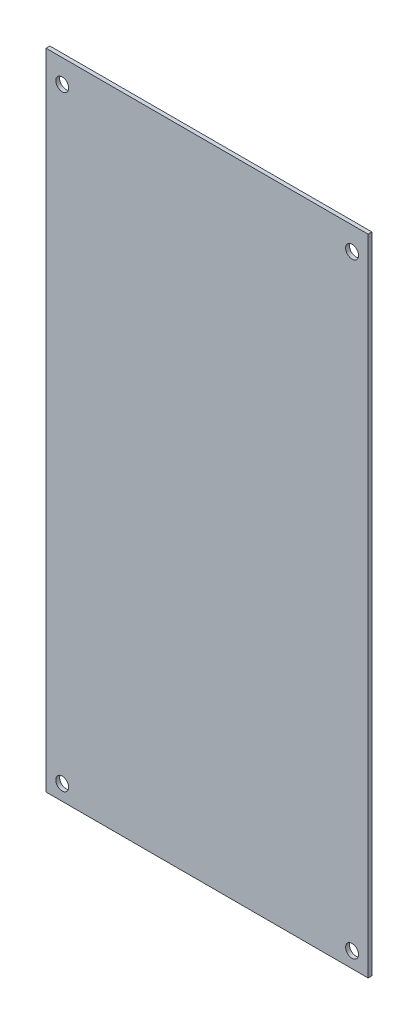
ISO-10303-21;
HEADER;
FILE_DESCRIPTION(('STEP AP214'),'2;1');
FILE_NAME('part.step','',(''),(''),'','','');
FILE_SCHEMA(('AUTOMOTIVE_DESIGN { 1 0 10303 214 1 1 1 1 }'));
ENDSEC;
DATA;
#1=APPLICATION_CONTEXT('core data for automotive mechanical design processes');
#2=APPLICATION_PROTOCOL_DEFINITION('international standard','automotive_design',2000,#1);
#3=PRODUCT_CONTEXT('',#1,'mechanical');
#4=PRODUCT('Part','Part','',(#3));
#5=PRODUCT_RELATED_PRODUCT_CATEGORY('part','',(#4));
#6=PRODUCT_DEFINITION_FORMATION('','',#4);
#7=PRODUCT_DEFINITION_CONTEXT('part definition',#1,'design');
#8=PRODUCT_DEFINITION('design','',#6,#7);
#9=PRODUCT_DEFINITION_SHAPE('','',#8);
#10=(LENGTH_UNIT() NAMED_UNIT(*) SI_UNIT(.MILLI.,.METRE.));
#11=(NAMED_UNIT(*) PLANE_ANGLE_UNIT() SI_UNIT($,.RADIAN.));
#12=(NAMED_UNIT(*) SI_UNIT($,.STERADIAN.) SOLID_ANGLE_UNIT());
#13=UNCERTAINTY_MEASURE_WITH_UNIT(LENGTH_MEASURE(1.E-05),#10,'distance_accuracy_value','');
#14=(GEOMETRIC_REPRESENTATION_CONTEXT(3) GLOBAL_UNCERTAINTY_ASSIGNED_CONTEXT((#13)) GLOBAL_UNIT_ASSIGNED_CONTEXT((#10,
#11,#12)) REPRESENTATION_CONTEXT('',''));
#15=CARTESIAN_POINT('',(0.,0.,0.));
#16=DIRECTION('',(0.,0.,1.));
#17=DIRECTION('',(1.,0.,0.));
#18=AXIS2_PLACEMENT_3D('',#15,#16,#17);
#19=CARTESIAN_POINT('',(0.,0.,3.));
#20=DIRECTION('',(1.,0.,0.));
#21=DIRECTION('',(0.,1.,0.));
#22=AXIS2_PLACEMENT_3D('',#19,#20,#21);
#23=PLANE('',#22);
#24=DIRECTION('',(0.,-1.,0.));
#25=VECTOR('',#24,1.);
#26=CARTESIAN_POINT('',(0.,0.,0.));
#27=LINE('',#26,#25);
#28=CARTESIAN_POINT('',(0.,500.,0.));
#29=VERTEX_POINT('',#28);
#30=CARTESIAN_POINT('',(0.,0.,0.));
#31=VERTEX_POINT('',#30);
#32=EDGE_CURVE('E96',#29,#31,#27,.T.);
#33=ORIENTED_EDGE('',*,*,#32,.T.);
#34=DIRECTION('',(0.,0.,-1.));
#35=VECTOR('',#34,1.);
#36=CARTESIAN_POINT('',(0.,0.,3.));
#37=LINE('',#36,#35);
#38=CARTESIAN_POINT('',(0.,0.,3.));
#39=VERTEX_POINT('',#38);
#40=EDGE_CURVE('E11',#39,#31,#37,.T.);
#41=ORIENTED_EDGE('',*,*,#40,.F.);
#42=DIRECTION('',(0.,-1.,0.));
#43=VECTOR('',#42,1.);
#44=CARTESIAN_POINT('',(0.,0.,3.));
#45=LINE('',#44,#43);
#46=CARTESIAN_POINT('',(0.,500.,3.));
#47=VERTEX_POINT('',#46);
#48=EDGE_CURVE('E84',#47,#39,#45,.T.);
#49=ORIENTED_EDGE('',*,*,#48,.F.);
#50=DIRECTION('',(0.,0.,-1.));
#51=VECTOR('',#50,1.);
#52=CARTESIAN_POINT('',(0.,500.,3.));
#53=LINE('',#52,#51);
#54=EDGE_CURVE('E92',#47,#29,#53,.T.);
#55=ORIENTED_EDGE('',*,*,#54,.T.);
#56=EDGE_LOOP('',(#33,#41,#49,#55));
#57=FACE_BOUND('',#56,.T.);
#58=ADVANCED_FACE('F33',(#57),#23,.F.);
#59=CARTESIAN_POINT('',(0.,0.,3.));
#60=DIRECTION('',(0.,1.,0.));
#61=DIRECTION('',(0.,0.,1.));
#62=AXIS2_PLACEMENT_3D('',#59,#60,#61);
#63=PLANE('',#62);
#64=DIRECTION('',(1.,0.,0.));
#65=VECTOR('',#64,1.);
#66=CARTESIAN_POINT('',(0.,0.,0.));
#67=LINE('',#66,#65);
#68=CARTESIAN_POINT('',(250.,0.,0.));
#69=VERTEX_POINT('',#68);
#70=EDGE_CURVE('E88',#31,#69,#67,.T.);
#71=ORIENTED_EDGE('',*,*,#70,.T.);
#72=DIRECTION('',(0.,0.,-1.));
#73=VECTOR('',#72,1.);
#74=CARTESIAN_POINT('',(250.,0.,3.));
#75=LINE('',#74,#73);
#76=CARTESIAN_POINT('',(250.,0.,3.));
#77=VERTEX_POINT('',#76);
#78=EDGE_CURVE('E41',#77,#69,#75,.T.);
#79=ORIENTED_EDGE('',*,*,#78,.F.);
#80=DIRECTION('',(1.,0.,0.));
#81=VECTOR('',#80,1.);
#82=CARTESIAN_POINT('',(0.,0.,3.));
#83=LINE('',#82,#81);
#84=EDGE_CURVE('E79',#39,#77,#83,.T.);
#85=ORIENTED_EDGE('',*,*,#84,.F.);
#86=ORIENTED_EDGE('',*,*,#40,.T.);
#87=EDGE_LOOP('',(#71,#79,#85,#86));
#88=FACE_BOUND('',#87,.T.);
#89=ADVANCED_FACE('F87',(#88),#63,.F.);
#90=CARTESIAN_POINT('',(250.,0.,3.));
#91=DIRECTION('',(-1.,0.,0.));
#92=DIRECTION('',(0.,-1.,0.));
#93=AXIS2_PLACEMENT_3D('',#90,#91,#92);
#94=PLANE('',#93);
#95=DIRECTION('',(0.,1.,0.));
#96=VECTOR('',#95,1.);
#97=CARTESIAN_POINT('',(250.,0.,0.));
#98=LINE('',#97,#96);
#99=CARTESIAN_POINT('',(250.,500.,0.));
#100=VERTEX_POINT('',#99);
#101=EDGE_CURVE('E66',#69,#100,#98,.T.);
#102=ORIENTED_EDGE('',*,*,#101,.T.);
#103=DIRECTION('',(0.,0.,-1.));
#104=VECTOR('',#103,1.);
#105=CARTESIAN_POINT('',(250.,500.,3.));
#106=LINE('',#105,#104);
#107=CARTESIAN_POINT('',(250.,500.,3.));
#108=VERTEX_POINT('',#107);
#109=EDGE_CURVE('E89',#108,#100,#106,.T.);
#110=ORIENTED_EDGE('',*,*,#109,.F.);
#111=DIRECTION('',(0.,1.,0.));
#112=VECTOR('',#111,1.);
#113=CARTESIAN_POINT('',(250.,0.,3.));
#114=LINE('',#113,#112);
#115=EDGE_CURVE('E82',#77,#108,#114,.T.);
#116=ORIENTED_EDGE('',*,*,#115,.F.);
#117=ORIENTED_EDGE('',*,*,#78,.T.);
#118=EDGE_LOOP('',(#102,#110,#116,#117));
#119=FACE_BOUND('',#118,.T.);
#120=ADVANCED_FACE('F90',(#119),#94,.F.);
#121=CARTESIAN_POINT('',(0.,500.,3.));
#122=DIRECTION('',(0.,-1.,0.));
#123=DIRECTION('',(0.,0.,-1.));
#124=AXIS2_PLACEMENT_3D('',#121,#122,#123);
#125=PLANE('',#124);
#126=DIRECTION('',(-1.,0.,0.));
#127=VECTOR('',#126,1.);
#128=CARTESIAN_POINT('',(0.,500.,0.));
#129=LINE('',#128,#127);
#130=EDGE_CURVE('E72',#100,#29,#129,.T.);
#131=ORIENTED_EDGE('',*,*,#130,.T.);
#132=ORIENTED_EDGE('',*,*,#54,.F.);
#133=DIRECTION('',(-1.,0.,0.));
#134=VECTOR('',#133,1.);
#135=CARTESIAN_POINT('',(0.,500.,3.));
#136=LINE('',#135,#134);
#137=EDGE_CURVE('E49',#108,#47,#136,.T.);
#138=ORIENTED_EDGE('',*,*,#137,.F.);
#139=ORIENTED_EDGE('',*,*,#109,.T.);
#140=EDGE_LOOP('',(#131,#132,#138,#139));
#141=FACE_BOUND('',#140,.T.);
#142=ADVANCED_FACE('F104',(#141),#125,.F.);
#143=CARTESIAN_POINT('',(0.,0.,3.));
#144=DIRECTION('',(0.,0.,-1.));
#145=DIRECTION('',(-1.,0.,0.));
#146=AXIS2_PLACEMENT_3D('',#143,#144,#145);
#147=PLANE('',#146);
#148=CARTESIAN_POINT('',(12.5618848715589,481.993805771851,3.));
#149=DIRECTION('',(0.,0.,1.));
#150=DIRECTION('',(1.,0.,0.));
#151=AXIS2_PLACEMENT_3D('',#148,#149,#150);
#152=CIRCLE('',#151,5.);
#153=CARTESIAN_POINT('',(17.5618848715589,481.993805771851,3.));
#154=VERTEX_POINT('',#153);
#155=EDGE_CURVE('E119',#154,#154,#152,.T.);
#156=ORIENTED_EDGE('',*,*,#155,.F.);
#157=EDGE_LOOP('',(#156));
#158=FACE_BOUND('',#157,.T.);
#159=CARTESIAN_POINT('',(237.561884871559,481.993805771851,3.));
#160=DIRECTION('',(0.,0.,1.));
#161=DIRECTION('',(1.,0.,0.));
#162=AXIS2_PLACEMENT_3D('',#159,#160,#161);
#163=CIRCLE('',#162,5.);
#164=CARTESIAN_POINT('',(242.561884871559,481.993805771851,3.));
#165=VERTEX_POINT('',#164);
#166=EDGE_CURVE('E125',#165,#165,#163,.T.);
#167=ORIENTED_EDGE('',*,*,#166,.F.);
#168=EDGE_LOOP('',(#167));
#169=FACE_BOUND('',#168,.T.);
#170=CARTESIAN_POINT('',(237.561884871559,11.9938057718514,3.));
#171=DIRECTION('',(0.,0.,1.));
#172=DIRECTION('',(1.,0.,0.));
#173=AXIS2_PLACEMENT_3D('',#170,#171,#172);
#174=CIRCLE('',#173,5.);
#175=CARTESIAN_POINT('',(242.561884871559,11.9938057718514,3.));
#176=VERTEX_POINT('',#175);
#177=EDGE_CURVE('E113',#176,#176,#174,.T.);
#178=ORIENTED_EDGE('',*,*,#177,.F.);
#179=EDGE_LOOP('',(#178));
#180=FACE_BOUND('',#179,.T.);
#181=CARTESIAN_POINT('',(12.561884871559,11.9938057718514,3.));
#182=DIRECTION('',(0.,0.,1.));
#183=DIRECTION('',(1.,0.,0.));
#184=AXIS2_PLACEMENT_3D('',#181,#182,#183);
#185=CIRCLE('',#184,5.);
#186=CARTESIAN_POINT('',(17.561884871559,11.9938057718514,3.));
#187=VERTEX_POINT('',#186);
#188=EDGE_CURVE('E99',#187,#187,#185,.T.);
#189=ORIENTED_EDGE('',*,*,#188,.F.);
#190=EDGE_LOOP('',(#189));
#191=FACE_BOUND('',#190,.T.);
#192=ORIENTED_EDGE('',*,*,#48,.T.);
#193=ORIENTED_EDGE('',*,*,#84,.T.);
#194=ORIENTED_EDGE('',*,*,#115,.T.);
#195=ORIENTED_EDGE('',*,*,#137,.T.);
#196=EDGE_LOOP('',(#192,#193,#194,#195));
#197=FACE_BOUND('',#196,.T.);
#198=ADVANCED_FACE('F80',(#158,#169,#180,#191,#197),#147,.F.);
#199=CARTESIAN_POINT('',(0.,0.,0.));
#200=DIRECTION('',(0.,0.,-1.));
#201=DIRECTION('',(-1.,0.,0.));
#202=AXIS2_PLACEMENT_3D('',#199,#200,#201);
#203=PLANE('',#202);
#204=CARTESIAN_POINT('',(12.5618848715589,481.993805771851,0.));
#205=DIRECTION('',(0.,0.,-1.));
#206=DIRECTION('',(-1.,0.,0.));
#207=AXIS2_PLACEMENT_3D('',#204,#205,#206);
#208=CIRCLE('',#207,5.);
#209=CARTESIAN_POINT('',(17.5618848715589,481.993805771851,0.));
#210=VERTEX_POINT('',#209);
#211=EDGE_CURVE('E128',#210,#210,#208,.F.);
#212=ORIENTED_EDGE('',*,*,#211,.T.);
#213=EDGE_LOOP('',(#212));
#214=FACE_BOUND('',#213,.T.);
#215=CARTESIAN_POINT('',(237.561884871559,481.993805771851,0.));
#216=DIRECTION('',(0.,0.,-1.));
#217=DIRECTION('',(-1.,0.,0.));
#218=AXIS2_PLACEMENT_3D('',#215,#216,#217);
#219=CIRCLE('',#218,5.);
#220=CARTESIAN_POINT('',(242.561884871559,481.993805771851,0.));
#221=VERTEX_POINT('',#220);
#222=EDGE_CURVE('E122',#221,#221,#219,.F.);
#223=ORIENTED_EDGE('',*,*,#222,.T.);
#224=EDGE_LOOP('',(#223));
#225=FACE_BOUND('',#224,.T.);
#226=CARTESIAN_POINT('',(237.561884871559,11.9938057718514,0.));
#227=DIRECTION('',(0.,0.,-1.));
#228=DIRECTION('',(-1.,0.,0.));
#229=AXIS2_PLACEMENT_3D('',#226,#227,#228);
#230=CIRCLE('',#229,5.);
#231=CARTESIAN_POINT('',(242.561884871559,11.9938057718514,0.));
#232=VERTEX_POINT('',#231);
#233=EDGE_CURVE('E116',#232,#232,#230,.F.);
#234=ORIENTED_EDGE('',*,*,#233,.T.);
#235=EDGE_LOOP('',(#234));
#236=FACE_BOUND('',#235,.T.);
#237=CARTESIAN_POINT('',(12.561884871559,11.9938057718514,0.));
#238=DIRECTION('',(0.,0.,-1.));
#239=DIRECTION('',(-1.,0.,0.));
#240=AXIS2_PLACEMENT_3D('',#237,#238,#239);
#241=CIRCLE('',#240,5.);
#242=CARTESIAN_POINT('',(17.561884871559,11.9938057718514,0.));
#243=VERTEX_POINT('',#242);
#244=EDGE_CURVE('E110',#243,#243,#241,.F.);
#245=ORIENTED_EDGE('',*,*,#244,.T.);
#246=EDGE_LOOP('',(#245));
#247=FACE_BOUND('',#246,.T.);
#248=ORIENTED_EDGE('',*,*,#32,.F.);
#249=ORIENTED_EDGE('',*,*,#130,.F.);
#250=ORIENTED_EDGE('',*,*,#101,.F.);
#251=ORIENTED_EDGE('',*,*,#70,.F.);
#252=EDGE_LOOP('',(#248,#249,#250,#251));
#253=FACE_BOUND('',#252,.T.);
#254=ADVANCED_FACE('F107',(#214,#225,#236,#247,#253),#203,.T.);
#255=CARTESIAN_POINT('',(12.561884871559,11.9938057718514,-0.00100000000000013));
#256=DIRECTION('',(0.,0.,1.));
#257=DIRECTION('',(1.,0.,0.));
#258=AXIS2_PLACEMENT_3D('',#255,#256,#257);
#259=CYLINDRICAL_SURFACE('',#258,5.);
#260=CARTESIAN_POINT('',(17.561884871559,11.9938057718514,0.));
#261=CARTESIAN_POINT('',(17.561884871559,11.9938057718514,0.03125));
#262=CARTESIAN_POINT('',(17.561884871559,11.9938057718514,0.0625));
#263=CARTESIAN_POINT('',(17.561884871559,11.9938057718514,0.125));
#264=CARTESIAN_POINT('',(17.561884871559,11.9938057718514,0.15625));
#265=CARTESIAN_POINT('',(17.561884871559,11.9938057718514,0.21875));
#266=CARTESIAN_POINT('',(17.561884871559,11.9938057718514,0.25));
#267=CARTESIAN_POINT('',(17.561884871559,11.9938057718514,0.3125));
#268=CARTESIAN_POINT('',(17.561884871559,11.9938057718514,0.34375));
#269=CARTESIAN_POINT('',(17.561884871559,11.9938057718514,0.40625));
#270=CARTESIAN_POINT('',(17.561884871559,11.9938057718514,0.4375));
#271=CARTESIAN_POINT('',(17.561884871559,11.9938057718514,0.5));
#272=CARTESIAN_POINT('',(17.561884871559,11.9938057718514,0.53125));
#273=CARTESIAN_POINT('',(17.561884871559,11.9938057718514,0.59375));
#274=CARTESIAN_POINT('',(17.561884871559,11.9938057718514,0.625));
#275=CARTESIAN_POINT('',(17.561884871559,11.9938057718514,0.6875));
#276=CARTESIAN_POINT('',(17.561884871559,11.9938057718514,0.71875));
#277=CARTESIAN_POINT('',(17.561884871559,11.9938057718514,0.78125));
#278=CARTESIAN_POINT('',(17.561884871559,11.9938057718514,0.8125));
#279=CARTESIAN_POINT('',(17.561884871559,11.9938057718514,0.875));
#280=CARTESIAN_POINT('',(17.561884871559,11.9938057718514,0.90625));
#281=CARTESIAN_POINT('',(17.561884871559,11.9938057718514,0.96875));
#282=CARTESIAN_POINT('',(17.561884871559,11.9938057718514,1.));
#283=CARTESIAN_POINT('',(17.561884871559,11.9938057718514,1.0625));
#284=CARTESIAN_POINT('',(17.561884871559,11.9938057718514,1.09375));
#285=CARTESIAN_POINT('',(17.561884871559,11.9938057718514,1.15625));
#286=CARTESIAN_POINT('',(17.561884871559,11.9938057718514,1.1875));
#287=CARTESIAN_POINT('',(17.561884871559,11.9938057718514,1.25));
#288=CARTESIAN_POINT('',(17.561884871559,11.9938057718514,1.28125));
#289=CARTESIAN_POINT('',(17.561884871559,11.9938057718514,1.34375));
#290=CARTESIAN_POINT('',(17.561884871559,11.9938057718514,1.375));
#291=CARTESIAN_POINT('',(17.561884871559,11.9938057718514,1.4375));
#292=CARTESIAN_POINT('',(17.561884871559,11.9938057718514,1.46875));
#293=CARTESIAN_POINT('',(17.561884871559,11.9938057718514,1.53125));
#294=CARTESIAN_POINT('',(17.561884871559,11.9938057718514,1.5625));
#295=CARTESIAN_POINT('',(17.561884871559,11.9938057718514,1.625));
#296=CARTESIAN_POINT('',(17.561884871559,11.9938057718514,1.65625));
#297=CARTESIAN_POINT('',(17.561884871559,11.9938057718514,1.71875));
#298=CARTESIAN_POINT('',(17.561884871559,11.9938057718514,1.75));
#299=CARTESIAN_POINT('',(17.561884871559,11.9938057718514,1.8125));
#300=CARTESIAN_POINT('',(17.561884871559,11.9938057718514,1.84375));
#301=CARTESIAN_POINT('',(17.561884871559,11.9938057718514,1.90625));
#302=CARTESIAN_POINT('',(17.561884871559,11.9938057718514,1.9375));
#303=CARTESIAN_POINT('',(17.561884871559,11.9938057718514,2.));
#304=CARTESIAN_POINT('',(17.561884871559,11.9938057718514,2.03125));
#305=CARTESIAN_POINT('',(17.561884871559,11.9938057718514,2.09375));
#306=CARTESIAN_POINT('',(17.561884871559,11.9938057718514,2.125));
#307=CARTESIAN_POINT('',(17.561884871559,11.9938057718514,2.1875));
#308=CARTESIAN_POINT('',(17.561884871559,11.9938057718514,2.21875));
#309=CARTESIAN_POINT('',(17.561884871559,11.9938057718514,2.28125));
#310=CARTESIAN_POINT('',(17.561884871559,11.9938057718514,2.3125));
#311=CARTESIAN_POINT('',(17.561884871559,11.9938057718514,2.375));
#312=CARTESIAN_POINT('',(17.561884871559,11.9938057718514,2.40625));
#313=CARTESIAN_POINT('',(17.561884871559,11.9938057718514,2.46875));
#314=CARTESIAN_POINT('',(17.561884871559,11.9938057718514,2.5));
#315=CARTESIAN_POINT('',(17.561884871559,11.9938057718514,2.5625));
#316=CARTESIAN_POINT('',(17.561884871559,11.9938057718514,2.59375));
#317=CARTESIAN_POINT('',(17.561884871559,11.9938057718514,2.65625));
#318=CARTESIAN_POINT('',(17.561884871559,11.9938057718514,2.6875));
#319=CARTESIAN_POINT('',(17.561884871559,11.9938057718514,2.75));
#320=CARTESIAN_POINT('',(17.561884871559,11.9938057718514,2.78125));
#321=CARTESIAN_POINT('',(17.561884871559,11.9938057718514,2.84375));
#322=CARTESIAN_POINT('',(17.561884871559,11.9938057718514,2.875));
#323=CARTESIAN_POINT('',(17.561884871559,11.9938057718514,2.9375));
#324=CARTESIAN_POINT('',(17.561884871559,11.9938057718514,2.96875));
#325=CARTESIAN_POINT('',(17.561884871559,11.9938057718514,3.));
#326=B_SPLINE_CURVE_WITH_KNOTS('',3,(#260,#261,#262,#263,#264,#265,#266,#267,#268,#269,#270,
#271,#272,#273,#274,#275,#276,#277,#278,#279,#280,#281,#282,#283,#284,#285,#286,#287,#288,#289,
#290,#291,#292,#293,#294,#295,#296,#297,#298,#299,#300,#301,#302,#303,#304,#305,#306,#307,#308,
#309,#310,#311,#312,#313,#314,#315,#316,#317,#318,#319,#320,#321,#322,#323,#324,#325),
.UNSPECIFIED.,.F.,.F.,(4,2,2,2,2,2,2,2,2,2,2,2,2,2,2,2,2,2,2,2,2,2,2,2,2,2,2,2,2,2,2,2,4),(0.,
0.09375,0.1875,0.28125,0.375,0.46875,0.5625,0.65625,0.75,0.84375,0.9375,1.03125,1.125,1.21875,
1.3125,1.40625,1.5,1.59375,1.6875,1.78125,1.875,1.96875,2.0625,2.15625,2.25,2.34375,2.4375,
2.53125,2.625,2.71875,2.8125,2.90625,3.),.UNSPECIFIED.);
#327=EDGE_CURVE('BSEAM145',#243,#187,#326,.T.);
#328=ORIENTED_EDGE('',*,*,#244,.F.);
#329=ORIENTED_EDGE('',*,*,#188,.T.);
#330=ORIENTED_EDGE('',*,*,#327,.T.);
#331=ORIENTED_EDGE('',*,*,#327,.F.);
#332=EDGE_LOOP('',(#328,#330,#329,#331));
#333=FACE_BOUND('',#332,.T.);
#334=ADVANCED_FACE('F145',(#333),#259,.F.);
#335=CARTESIAN_POINT('',(237.561884871559,11.9938057718514,-0.00100000000000013));
#336=DIRECTION('',(0.,0.,1.));
#337=DIRECTION('',(1.,0.,0.));
#338=AXIS2_PLACEMENT_3D('',#335,#336,#337);
#339=CYLINDRICAL_SURFACE('',#338,5.);
#340=CARTESIAN_POINT('',(242.561884871559,11.9938057718514,0.));
#341=CARTESIAN_POINT('',(242.561884871559,11.9938057718514,0.03125));
#342=CARTESIAN_POINT('',(242.561884871559,11.9938057718514,0.0625));
#343=CARTESIAN_POINT('',(242.561884871559,11.9938057718514,0.125));
#344=CARTESIAN_POINT('',(242.561884871559,11.9938057718514,0.15625));
#345=CARTESIAN_POINT('',(242.561884871559,11.9938057718514,0.21875));
#346=CARTESIAN_POINT('',(242.561884871559,11.9938057718514,0.25));
#347=CARTESIAN_POINT('',(242.561884871559,11.9938057718514,0.3125));
#348=CARTESIAN_POINT('',(242.561884871559,11.9938057718514,0.34375));
#349=CARTESIAN_POINT('',(242.561884871559,11.9938057718514,0.40625));
#350=CARTESIAN_POINT('',(242.561884871559,11.9938057718514,0.4375));
#351=CARTESIAN_POINT('',(242.561884871559,11.9938057718514,0.5));
#352=CARTESIAN_POINT('',(242.561884871559,11.9938057718514,0.53125));
#353=CARTESIAN_POINT('',(242.561884871559,11.9938057718514,0.59375));
#354=CARTESIAN_POINT('',(242.561884871559,11.9938057718514,0.625));
#355=CARTESIAN_POINT('',(242.561884871559,11.9938057718514,0.6875));
#356=CARTESIAN_POINT('',(242.561884871559,11.9938057718514,0.71875));
#357=CARTESIAN_POINT('',(242.561884871559,11.9938057718514,0.78125));
#358=CARTESIAN_POINT('',(242.561884871559,11.9938057718514,0.8125));
#359=CARTESIAN_POINT('',(242.561884871559,11.9938057718514,0.875));
#360=CARTESIAN_POINT('',(242.561884871559,11.9938057718514,0.90625));
#361=CARTESIAN_POINT('',(242.561884871559,11.9938057718514,0.96875));
#362=CARTESIAN_POINT('',(242.561884871559,11.9938057718514,1.));
#363=CARTESIAN_POINT('',(242.561884871559,11.9938057718514,1.0625));
#364=CARTESIAN_POINT('',(242.561884871559,11.9938057718514,1.09375));
#365=CARTESIAN_POINT('',(242.561884871559,11.9938057718514,1.15625));
#366=CARTESIAN_POINT('',(242.561884871559,11.9938057718514,1.1875));
#367=CARTESIAN_POINT('',(242.561884871559,11.9938057718514,1.25));
#368=CARTESIAN_POINT('',(242.561884871559,11.9938057718514,1.28125));
#369=CARTESIAN_POINT('',(242.561884871559,11.9938057718514,1.34375));
#370=CARTESIAN_POINT('',(242.561884871559,11.9938057718514,1.375));
#371=CARTESIAN_POINT('',(242.561884871559,11.9938057718514,1.4375));
#372=CARTESIAN_POINT('',(242.561884871559,11.9938057718514,1.46875));
#373=CARTESIAN_POINT('',(242.561884871559,11.9938057718514,1.53125));
#374=CARTESIAN_POINT('',(242.561884871559,11.9938057718514,1.5625));
#375=CARTESIAN_POINT('',(242.561884871559,11.9938057718514,1.625));
#376=CARTESIAN_POINT('',(242.561884871559,11.9938057718514,1.65625));
#377=CARTESIAN_POINT('',(242.561884871559,11.9938057718514,1.71875));
#378=CARTESIAN_POINT('',(242.561884871559,11.9938057718514,1.75));
#379=CARTESIAN_POINT('',(242.561884871559,11.9938057718514,1.8125));
#380=CARTESIAN_POINT('',(242.561884871559,11.9938057718514,1.84375));
#381=CARTESIAN_POINT('',(242.561884871559,11.9938057718514,1.90625));
#382=CARTESIAN_POINT('',(242.561884871559,11.9938057718514,1.9375));
#383=CARTESIAN_POINT('',(242.561884871559,11.9938057718514,2.));
#384=CARTESIAN_POINT('',(242.561884871559,11.9938057718514,2.03125));
#385=CARTESIAN_POINT('',(242.561884871559,11.9938057718514,2.09375));
#386=CARTESIAN_POINT('',(242.561884871559,11.9938057718514,2.125));
#387=CARTESIAN_POINT('',(242.561884871559,11.9938057718514,2.1875));
#388=CARTESIAN_POINT('',(242.561884871559,11.9938057718514,2.21875));
#389=CARTESIAN_POINT('',(242.561884871559,11.9938057718514,2.28125));
#390=CARTESIAN_POINT('',(242.561884871559,11.9938057718514,2.3125));
#391=CARTESIAN_POINT('',(242.561884871559,11.9938057718514,2.375));
#392=CARTESIAN_POINT('',(242.561884871559,11.9938057718514,2.40625));
#393=CARTESIAN_POINT('',(242.561884871559,11.9938057718514,2.46875));
#394=CARTESIAN_POINT('',(242.561884871559,11.9938057718514,2.5));
#395=CARTESIAN_POINT('',(242.561884871559,11.9938057718514,2.5625));
#396=CARTESIAN_POINT('',(242.561884871559,11.9938057718514,2.59375));
#397=CARTESIAN_POINT('',(242.561884871559,11.9938057718514,2.65625));
#398=CARTESIAN_POINT('',(242.561884871559,11.9938057718514,2.6875));
#399=CARTESIAN_POINT('',(242.561884871559,11.9938057718514,2.75));
#400=CARTESIAN_POINT('',(242.561884871559,11.9938057718514,2.78125));
#401=CARTESIAN_POINT('',(242.561884871559,11.9938057718514,2.84375));
#402=CARTESIAN_POINT('',(242.561884871559,11.9938057718514,2.875));
#403=CARTESIAN_POINT('',(242.561884871559,11.9938057718514,2.9375));
#404=CARTESIAN_POINT('',(242.561884871559,11.9938057718514,2.96875));
#405=CARTESIAN_POINT('',(242.561884871559,11.9938057718514,3.));
#406=B_SPLINE_CURVE_WITH_KNOTS('',3,(#340,#341,#342,#343,#344,#345,#346,#347,#348,#349,#350,
#351,#352,#353,#354,#355,#356,#357,#358,#359,#360,#361,#362,#363,#364,#365,#366,#367,#368,#369,
#370,#371,#372,#373,#374,#375,#376,#377,#378,#379,#380,#381,#382,#383,#384,#385,#386,#387,#388,
#389,#390,#391,#392,#393,#394,#395,#396,#397,#398,#399,#400,#401,#402,#403,#404,#405),
.UNSPECIFIED.,.F.,.F.,(4,2,2,2,2,2,2,2,2,2,2,2,2,2,2,2,2,2,2,2,2,2,2,2,2,2,2,2,2,2,2,2,4),(0.,
0.09375,0.1875,0.28125,0.375,0.46875,0.5625,0.65625,0.75,0.84375,0.9375,1.03125,1.125,1.21875,
1.3125,1.40625,1.5,1.59375,1.6875,1.78125,1.875,1.96875,2.0625,2.15625,2.25,2.34375,2.4375,
2.53125,2.625,2.71875,2.8125,2.90625,3.),.UNSPECIFIED.);
#407=EDGE_CURVE('BSEAM147',#232,#176,#406,.T.);
#408=ORIENTED_EDGE('',*,*,#233,.F.);
#409=ORIENTED_EDGE('',*,*,#177,.T.);
#410=ORIENTED_EDGE('',*,*,#407,.T.);
#411=ORIENTED_EDGE('',*,*,#407,.F.);
#412=EDGE_LOOP('',(#408,#410,#409,#411));
#413=FACE_BOUND('',#412,.T.);
#414=ADVANCED_FACE('F147',(#413),#339,.F.);
#415=CARTESIAN_POINT('',(237.561884871559,481.993805771851,-0.00100000000000013));
#416=DIRECTION('',(0.,0.,1.));
#417=DIRECTION('',(1.,0.,0.));
#418=AXIS2_PLACEMENT_3D('',#415,#416,#417);
#419=CYLINDRICAL_SURFACE('',#418,5.);
#420=CARTESIAN_POINT('',(242.561884871559,481.993805771851,0.));
#421=CARTESIAN_POINT('',(242.561884871559,481.993805771851,0.03125));
#422=CARTESIAN_POINT('',(242.561884871559,481.993805771851,0.0625));
#423=CARTESIAN_POINT('',(242.561884871559,481.993805771851,0.125));
#424=CARTESIAN_POINT('',(242.561884871559,481.993805771851,0.15625));
#425=CARTESIAN_POINT('',(242.561884871559,481.993805771851,0.21875));
#426=CARTESIAN_POINT('',(242.561884871559,481.993805771851,0.25));
#427=CARTESIAN_POINT('',(242.561884871559,481.993805771851,0.3125));
#428=CARTESIAN_POINT('',(242.561884871559,481.993805771851,0.34375));
#429=CARTESIAN_POINT('',(242.561884871559,481.993805771851,0.40625));
#430=CARTESIAN_POINT('',(242.561884871559,481.993805771851,0.4375));
#431=CARTESIAN_POINT('',(242.561884871559,481.993805771851,0.5));
#432=CARTESIAN_POINT('',(242.561884871559,481.993805771851,0.53125));
#433=CARTESIAN_POINT('',(242.561884871559,481.993805771851,0.59375));
#434=CARTESIAN_POINT('',(242.561884871559,481.993805771851,0.625));
#435=CARTESIAN_POINT('',(242.561884871559,481.993805771851,0.6875));
#436=CARTESIAN_POINT('',(242.561884871559,481.993805771851,0.71875));
#437=CARTESIAN_POINT('',(242.561884871559,481.993805771851,0.78125));
#438=CARTESIAN_POINT('',(242.561884871559,481.993805771851,0.8125));
#439=CARTESIAN_POINT('',(242.561884871559,481.993805771851,0.875));
#440=CARTESIAN_POINT('',(242.561884871559,481.993805771851,0.90625));
#441=CARTESIAN_POINT('',(242.561884871559,481.993805771851,0.96875));
#442=CARTESIAN_POINT('',(242.561884871559,481.993805771851,1.));
#443=CARTESIAN_POINT('',(242.561884871559,481.993805771851,1.0625));
#444=CARTESIAN_POINT('',(242.561884871559,481.993805771851,1.09375));
#445=CARTESIAN_POINT('',(242.561884871559,481.993805771851,1.15625));
#446=CARTESIAN_POINT('',(242.561884871559,481.993805771851,1.1875));
#447=CARTESIAN_POINT('',(242.561884871559,481.993805771851,1.25));
#448=CARTESIAN_POINT('',(242.561884871559,481.993805771851,1.28125));
#449=CARTESIAN_POINT('',(242.561884871559,481.993805771851,1.34375));
#450=CARTESIAN_POINT('',(242.561884871559,481.993805771851,1.375));
#451=CARTESIAN_POINT('',(242.561884871559,481.993805771851,1.4375));
#452=CARTESIAN_POINT('',(242.561884871559,481.993805771851,1.46875));
#453=CARTESIAN_POINT('',(242.561884871559,481.993805771851,1.53125));
#454=CARTESIAN_POINT('',(242.561884871559,481.993805771851,1.5625));
#455=CARTESIAN_POINT('',(242.561884871559,481.993805771851,1.625));
#456=CARTESIAN_POINT('',(242.561884871559,481.993805771851,1.65625));
#457=CARTESIAN_POINT('',(242.561884871559,481.993805771851,1.71875));
#458=CARTESIAN_POINT('',(242.561884871559,481.993805771851,1.75));
#459=CARTESIAN_POINT('',(242.561884871559,481.993805771851,1.8125));
#460=CARTESIAN_POINT('',(242.561884871559,481.993805771851,1.84375));
#461=CARTESIAN_POINT('',(242.561884871559,481.993805771851,1.90625));
#462=CARTESIAN_POINT('',(242.561884871559,481.993805771851,1.9375));
#463=CARTESIAN_POINT('',(242.561884871559,481.993805771851,2.));
#464=CARTESIAN_POINT('',(242.561884871559,481.993805771851,2.03125));
#465=CARTESIAN_POINT('',(242.561884871559,481.993805771851,2.09375));
#466=CARTESIAN_POINT('',(242.561884871559,481.993805771851,2.125));
#467=CARTESIAN_POINT('',(242.561884871559,481.993805771851,2.1875));
#468=CARTESIAN_POINT('',(242.561884871559,481.993805771851,2.21875));
#469=CARTESIAN_POINT('',(242.561884871559,481.993805771851,2.28125));
#470=CARTESIAN_POINT('',(242.561884871559,481.993805771851,2.3125));
#471=CARTESIAN_POINT('',(242.561884871559,481.993805771851,2.375));
#472=CARTESIAN_POINT('',(242.561884871559,481.993805771851,2.40625));
#473=CARTESIAN_POINT('',(242.561884871559,481.993805771851,2.46875));
#474=CARTESIAN_POINT('',(242.561884871559,481.993805771851,2.5));
#475=CARTESIAN_POINT('',(242.561884871559,481.993805771851,2.5625));
#476=CARTESIAN_POINT('',(242.561884871559,481.993805771851,2.59375));
#477=CARTESIAN_POINT('',(242.561884871559,481.993805771851,2.65625));
#478=CARTESIAN_POINT('',(242.561884871559,481.993805771851,2.6875));
#479=CARTESIAN_POINT('',(242.561884871559,481.993805771851,2.75));
#480=CARTESIAN_POINT('',(242.561884871559,481.993805771851,2.78125));
#481=CARTESIAN_POINT('',(242.561884871559,481.993805771851,2.84375));
#482=CARTESIAN_POINT('',(242.561884871559,481.993805771851,2.875));
#483=CARTESIAN_POINT('',(242.561884871559,481.993805771851,2.9375));
#484=CARTESIAN_POINT('',(242.561884871559,481.993805771851,2.96875));
#485=CARTESIAN_POINT('',(242.561884871559,481.993805771851,3.));
#486=B_SPLINE_CURVE_WITH_KNOTS('',3,(#420,#421,#422,#423,#424,#425,#426,#427,#428,#429,#430,
#431,#432,#433,#434,#435,#436,#437,#438,#439,#440,#441,#442,#443,#444,#445,#446,#447,#448,#449,
#450,#451,#452,#453,#454,#455,#456,#457,#458,#459,#460,#461,#462,#463,#464,#465,#466,#467,#468,
#469,#470,#471,#472,#473,#474,#475,#476,#477,#478,#479,#480,#481,#482,#483,#484,#485),
.UNSPECIFIED.,.F.,.F.,(4,2,2,2,2,2,2,2,2,2,2,2,2,2,2,2,2,2,2,2,2,2,2,2,2,2,2,2,2,2,2,2,4),(0.,
0.09375,0.1875,0.28125,0.375,0.46875,0.5625,0.65625,0.75,0.84375,0.9375,1.03125,1.125,1.21875,
1.3125,1.40625,1.5,1.59375,1.6875,1.78125,1.875,1.96875,2.0625,2.15625,2.25,2.34375,2.4375,
2.53125,2.625,2.71875,2.8125,2.90625,3.),.UNSPECIFIED.);
#487=EDGE_CURVE('BSEAM154',#221,#165,#486,.T.);
#488=ORIENTED_EDGE('',*,*,#222,.F.);
#489=ORIENTED_EDGE('',*,*,#166,.T.);
#490=ORIENTED_EDGE('',*,*,#487,.T.);
#491=ORIENTED_EDGE('',*,*,#487,.F.);
#492=EDGE_LOOP('',(#488,#490,#489,#491));
#493=FACE_BOUND('',#492,.T.);
#494=ADVANCED_FACE('F154',(#493),#419,.F.);
#495=CARTESIAN_POINT('',(12.5618848715589,481.993805771851,-0.00100000000000013));
#496=DIRECTION('',(0.,0.,1.));
#497=DIRECTION('',(1.,0.,0.));
#498=AXIS2_PLACEMENT_3D('',#495,#496,#497);
#499=CYLINDRICAL_SURFACE('',#498,5.);
#500=CARTESIAN_POINT('',(17.5618848715589,481.993805771851,0.));
#501=CARTESIAN_POINT('',(17.5618848715589,481.993805771851,0.03125));
#502=CARTESIAN_POINT('',(17.5618848715589,481.993805771851,0.0625));
#503=CARTESIAN_POINT('',(17.5618848715589,481.993805771851,0.125));
#504=CARTESIAN_POINT('',(17.5618848715589,481.993805771851,0.15625));
#505=CARTESIAN_POINT('',(17.5618848715589,481.993805771851,0.21875));
#506=CARTESIAN_POINT('',(17.5618848715589,481.993805771851,0.25));
#507=CARTESIAN_POINT('',(17.5618848715589,481.993805771851,0.3125));
#508=CARTESIAN_POINT('',(17.5618848715589,481.993805771851,0.34375));
#509=CARTESIAN_POINT('',(17.5618848715589,481.993805771851,0.40625));
#510=CARTESIAN_POINT('',(17.5618848715589,481.993805771851,0.4375));
#511=CARTESIAN_POINT('',(17.5618848715589,481.993805771851,0.5));
#512=CARTESIAN_POINT('',(17.5618848715589,481.993805771851,0.53125));
#513=CARTESIAN_POINT('',(17.5618848715589,481.993805771851,0.59375));
#514=CARTESIAN_POINT('',(17.5618848715589,481.993805771851,0.625));
#515=CARTESIAN_POINT('',(17.5618848715589,481.993805771851,0.6875));
#516=CARTESIAN_POINT('',(17.5618848715589,481.993805771851,0.71875));
#517=CARTESIAN_POINT('',(17.5618848715589,481.993805771851,0.78125));
#518=CARTESIAN_POINT('',(17.5618848715589,481.993805771851,0.8125));
#519=CARTESIAN_POINT('',(17.5618848715589,481.993805771851,0.875));
#520=CARTESIAN_POINT('',(17.5618848715589,481.993805771851,0.90625));
#521=CARTESIAN_POINT('',(17.5618848715589,481.993805771851,0.96875));
#522=CARTESIAN_POINT('',(17.5618848715589,481.993805771851,1.));
#523=CARTESIAN_POINT('',(17.5618848715589,481.993805771851,1.0625));
#524=CARTESIAN_POINT('',(17.5618848715589,481.993805771851,1.09375));
#525=CARTESIAN_POINT('',(17.5618848715589,481.993805771851,1.15625));
#526=CARTESIAN_POINT('',(17.5618848715589,481.993805771851,1.1875));
#527=CARTESIAN_POINT('',(17.5618848715589,481.993805771851,1.25));
#528=CARTESIAN_POINT('',(17.5618848715589,481.993805771851,1.28125));
#529=CARTESIAN_POINT('',(17.5618848715589,481.993805771851,1.34375));
#530=CARTESIAN_POINT('',(17.5618848715589,481.993805771851,1.375));
#531=CARTESIAN_POINT('',(17.5618848715589,481.993805771851,1.4375));
#532=CARTESIAN_POINT('',(17.5618848715589,481.993805771851,1.46875));
#533=CARTESIAN_POINT('',(17.5618848715589,481.993805771851,1.53125));
#534=CARTESIAN_POINT('',(17.5618848715589,481.993805771851,1.5625));
#535=CARTESIAN_POINT('',(17.5618848715589,481.993805771851,1.625));
#536=CARTESIAN_POINT('',(17.5618848715589,481.993805771851,1.65625));
#537=CARTESIAN_POINT('',(17.5618848715589,481.993805771851,1.71875));
#538=CARTESIAN_POINT('',(17.5618848715589,481.993805771851,1.75));
#539=CARTESIAN_POINT('',(17.5618848715589,481.993805771851,1.8125));
#540=CARTESIAN_POINT('',(17.5618848715589,481.993805771851,1.84375));
#541=CARTESIAN_POINT('',(17.5618848715589,481.993805771851,1.90625));
#542=CARTESIAN_POINT('',(17.5618848715589,481.993805771851,1.9375));
#543=CARTESIAN_POINT('',(17.5618848715589,481.993805771851,2.));
#544=CARTESIAN_POINT('',(17.5618848715589,481.993805771851,2.03125));
#545=CARTESIAN_POINT('',(17.5618848715589,481.993805771851,2.09375));
#546=CARTESIAN_POINT('',(17.5618848715589,481.993805771851,2.125));
#547=CARTESIAN_POINT('',(17.5618848715589,481.993805771851,2.1875));
#548=CARTESIAN_POINT('',(17.5618848715589,481.993805771851,2.21875));
#549=CARTESIAN_POINT('',(17.5618848715589,481.993805771851,2.28125));
#550=CARTESIAN_POINT('',(17.5618848715589,481.993805771851,2.3125));
#551=CARTESIAN_POINT('',(17.5618848715589,481.993805771851,2.375));
#552=CARTESIAN_POINT('',(17.5618848715589,481.993805771851,2.40625));
#553=CARTESIAN_POINT('',(17.5618848715589,481.993805771851,2.46875));
#554=CARTESIAN_POINT('',(17.5618848715589,481.993805771851,2.5));
#555=CARTESIAN_POINT('',(17.5618848715589,481.993805771851,2.5625));
#556=CARTESIAN_POINT('',(17.5618848715589,481.993805771851,2.59375));
#557=CARTESIAN_POINT('',(17.5618848715589,481.993805771851,2.65625));
#558=CARTESIAN_POINT('',(17.5618848715589,481.993805771851,2.6875));
#559=CARTESIAN_POINT('',(17.5618848715589,481.993805771851,2.75));
#560=CARTESIAN_POINT('',(17.5618848715589,481.993805771851,2.78125));
#561=CARTESIAN_POINT('',(17.5618848715589,481.993805771851,2.84375));
#562=CARTESIAN_POINT('',(17.5618848715589,481.993805771851,2.875));
#563=CARTESIAN_POINT('',(17.5618848715589,481.993805771851,2.9375));
#564=CARTESIAN_POINT('',(17.5618848715589,481.993805771851,2.96875));
#565=CARTESIAN_POINT('',(17.5618848715589,481.993805771851,3.));
#566=B_SPLINE_CURVE_WITH_KNOTS('',3,(#500,#501,#502,#503,#504,#505,#506,#507,#508,#509,#510,
#511,#512,#513,#514,#515,#516,#517,#518,#519,#520,#521,#522,#523,#524,#525,#526,#527,#528,#529,
#530,#531,#532,#533,#534,#535,#536,#537,#538,#539,#540,#541,#542,#543,#544,#545,#546,#547,#548,
#549,#550,#551,#552,#553,#554,#555,#556,#557,#558,#559,#560,#561,#562,#563,#564,#565),
.UNSPECIFIED.,.F.,.F.,(4,2,2,2,2,2,2,2,2,2,2,2,2,2,2,2,2,2,2,2,2,2,2,2,2,2,2,2,2,2,2,2,4),(0.,
0.09375,0.1875,0.28125,0.375,0.46875,0.5625,0.65625,0.75,0.84375,0.9375,1.03125,1.125,1.21875,
1.3125,1.40625,1.5,1.59375,1.6875,1.78125,1.875,1.96875,2.0625,2.15625,2.25,2.34375,2.4375,
2.53125,2.625,2.71875,2.8125,2.90625,3.),.UNSPECIFIED.);
#567=EDGE_CURVE('BSEAM134',#210,#154,#566,.T.);
#568=ORIENTED_EDGE('',*,*,#211,.F.);
#569=ORIENTED_EDGE('',*,*,#155,.T.);
#570=ORIENTED_EDGE('',*,*,#567,.T.);
#571=ORIENTED_EDGE('',*,*,#567,.F.);
#572=EDGE_LOOP('',(#568,#570,#569,#571));
#573=FACE_BOUND('',#572,.T.);
#574=ADVANCED_FACE('F134',(#573),#499,.F.);
#575=CLOSED_SHELL('',(#58,#89,#120,#142,#198,#254,#334,#414,#494,#574));
#576=MANIFOLD_SOLID_BREP('B2',#575);
#577=ADVANCED_BREP_SHAPE_REPRESENTATION('',(#18,#576),#14);
#578=SHAPE_DEFINITION_REPRESENTATION(#9,#577);
ENDSEC;
END-ISO-10303-21;
